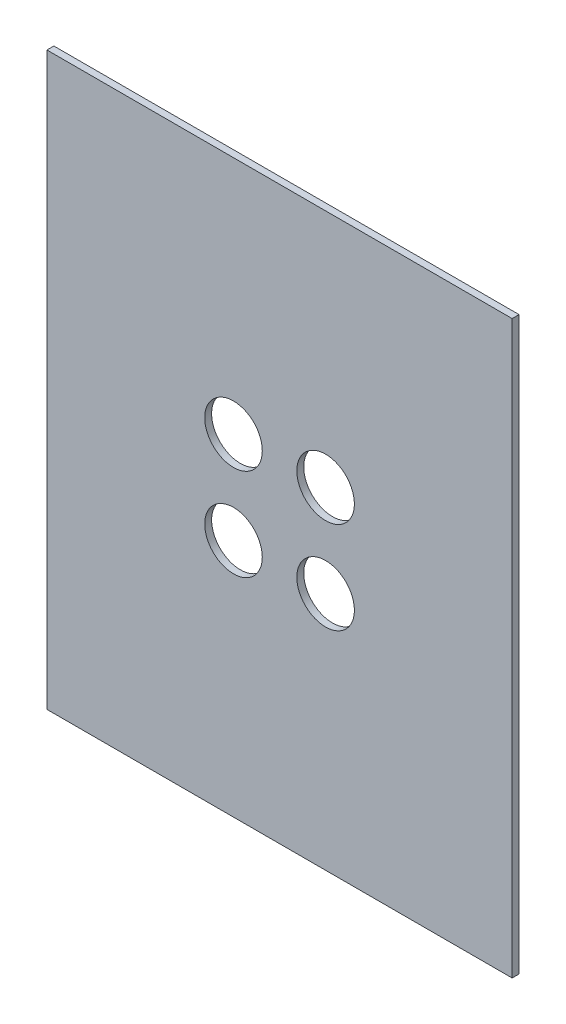
ISO-10303-21;
HEADER;
FILE_DESCRIPTION(('STEP AP214'),'2;1');
FILE_NAME('part.step','',(''),(''),'','','');
FILE_SCHEMA(('AUTOMOTIVE_DESIGN { 1 0 10303 214 1 1 1 1 }'));
ENDSEC;
DATA;
#1=APPLICATION_CONTEXT('core data for automotive mechanical design processes');
#2=APPLICATION_PROTOCOL_DEFINITION('international standard','automotive_design',2000,#1);
#3=PRODUCT_CONTEXT('',#1,'mechanical');
#4=PRODUCT('Part','Part','',(#3));
#5=PRODUCT_RELATED_PRODUCT_CATEGORY('part','',(#4));
#6=PRODUCT_DEFINITION_FORMATION('','',#4);
#7=PRODUCT_DEFINITION_CONTEXT('part definition',#1,'design');
#8=PRODUCT_DEFINITION('design','',#6,#7);
#9=PRODUCT_DEFINITION_SHAPE('','',#8);
#10=(LENGTH_UNIT() NAMED_UNIT(*) SI_UNIT(.MILLI.,.METRE.));
#11=(NAMED_UNIT(*) PLANE_ANGLE_UNIT() SI_UNIT($,.RADIAN.));
#12=(NAMED_UNIT(*) SI_UNIT($,.STERADIAN.) SOLID_ANGLE_UNIT());
#13=UNCERTAINTY_MEASURE_WITH_UNIT(LENGTH_MEASURE(1.E-05),#10,'distance_accuracy_value','');
#14=(GEOMETRIC_REPRESENTATION_CONTEXT(3) GLOBAL_UNCERTAINTY_ASSIGNED_CONTEXT((#13)) GLOBAL_UNIT_ASSIGNED_CONTEXT((#10,
#11,#12)) REPRESENTATION_CONTEXT('',''));
#15=CARTESIAN_POINT('',(0.,0.,0.));
#16=DIRECTION('',(0.,0.,1.));
#17=DIRECTION('',(1.,0.,0.));
#18=AXIS2_PLACEMENT_3D('',#15,#16,#17);
#19=CARTESIAN_POINT('',(-63.562559803188,77.1924619640387,3.));
#20=DIRECTION('',(1.,0.,0.));
#21=DIRECTION('',(0.,1.,0.));
#22=AXIS2_PLACEMENT_3D('',#19,#20,#21);
#23=PLANE('',#22);
#24=DIRECTION('',(0.,-1.,0.));
#25=VECTOR('',#24,1.);
#26=CARTESIAN_POINT('',(-63.562559803188,77.1924619640387,0.));
#27=LINE('',#26,#25);
#28=CARTESIAN_POINT('',(-63.562559803188,77.1924619640387,0.));
#29=VERTEX_POINT('',#28);
#30=CARTESIAN_POINT('',(-63.562559803188,-170.807538035961,0.));
#31=VERTEX_POINT('',#30);
#32=EDGE_CURVE('E96',#29,#31,#27,.T.);
#33=ORIENTED_EDGE('',*,*,#32,.T.);
#34=DIRECTION('',(0.,0.,-1.));
#35=VECTOR('',#34,1.);
#36=CARTESIAN_POINT('',(-63.562559803188,-170.807538035961,3.));
#37=LINE('',#36,#35);
#38=CARTESIAN_POINT('',(-63.562559803188,-170.807538035961,3.));
#39=VERTEX_POINT('',#38);
#40=EDGE_CURVE('E11',#39,#31,#37,.T.);
#41=ORIENTED_EDGE('',*,*,#40,.F.);
#42=DIRECTION('',(0.,-1.,0.));
#43=VECTOR('',#42,1.);
#44=CARTESIAN_POINT('',(-63.562559803188,77.1924619640387,3.));
#45=LINE('',#44,#43);
#46=CARTESIAN_POINT('',(-63.562559803188,77.1924619640387,3.));
#47=VERTEX_POINT('',#46);
#48=EDGE_CURVE('E84',#47,#39,#45,.T.);
#49=ORIENTED_EDGE('',*,*,#48,.F.);
#50=DIRECTION('',(0.,0.,-1.));
#51=VECTOR('',#50,1.);
#52=CARTESIAN_POINT('',(-63.562559803188,77.1924619640387,3.));
#53=LINE('',#52,#51);
#54=EDGE_CURVE('E92',#47,#29,#53,.T.);
#55=ORIENTED_EDGE('',*,*,#54,.T.);
#56=EDGE_LOOP('',(#33,#41,#49,#55));
#57=FACE_BOUND('',#56,.T.);
#58=ADVANCED_FACE('F33',(#57),#23,.F.);
#59=CARTESIAN_POINT('',(-63.562559803188,-170.807538035961,3.));
#60=DIRECTION('',(0.,1.,0.));
#61=DIRECTION('',(0.,0.,1.));
#62=AXIS2_PLACEMENT_3D('',#59,#60,#61);
#63=PLANE('',#62);
#64=DIRECTION('',(1.,0.,0.));
#65=VECTOR('',#64,1.);
#66=CARTESIAN_POINT('',(-63.562559803188,-170.807538035961,0.));
#67=LINE('',#66,#65);
#68=CARTESIAN_POINT('',(138.437440196812,-170.807538035961,0.));
#69=VERTEX_POINT('',#68);
#70=EDGE_CURVE('E88',#31,#69,#67,.T.);
#71=ORIENTED_EDGE('',*,*,#70,.T.);
#72=DIRECTION('',(0.,0.,-1.));
#73=VECTOR('',#72,1.);
#74=CARTESIAN_POINT('',(138.437440196812,-170.807538035961,3.));
#75=LINE('',#74,#73);
#76=CARTESIAN_POINT('',(138.437440196812,-170.807538035961,3.));
#77=VERTEX_POINT('',#76);
#78=EDGE_CURVE('E41',#77,#69,#75,.T.);
#79=ORIENTED_EDGE('',*,*,#78,.F.);
#80=DIRECTION('',(1.,0.,0.));
#81=VECTOR('',#80,1.);
#82=CARTESIAN_POINT('',(-63.562559803188,-170.807538035961,3.));
#83=LINE('',#82,#81);
#84=EDGE_CURVE('E79',#39,#77,#83,.T.);
#85=ORIENTED_EDGE('',*,*,#84,.F.);
#86=ORIENTED_EDGE('',*,*,#40,.T.);
#87=EDGE_LOOP('',(#71,#79,#85,#86));
#88=FACE_BOUND('',#87,.T.);
#89=ADVANCED_FACE('F87',(#88),#63,.F.);
#90=CARTESIAN_POINT('',(138.437440196812,77.1924619640387,3.));
#91=DIRECTION('',(-1.,0.,0.));
#92=DIRECTION('',(0.,-1.,0.));
#93=AXIS2_PLACEMENT_3D('',#90,#91,#92);
#94=PLANE('',#93);
#95=DIRECTION('',(0.,1.,0.));
#96=VECTOR('',#95,1.);
#97=CARTESIAN_POINT('',(138.437440196812,77.1924619640387,0.));
#98=LINE('',#97,#96);
#99=CARTESIAN_POINT('',(138.437440196812,77.1924619640387,0.));
#100=VERTEX_POINT('',#99);
#101=EDGE_CURVE('E66',#69,#100,#98,.T.);
#102=ORIENTED_EDGE('',*,*,#101,.T.);
#103=DIRECTION('',(0.,0.,-1.));
#104=VECTOR('',#103,1.);
#105=CARTESIAN_POINT('',(138.437440196812,77.1924619640387,3.));
#106=LINE('',#105,#104);
#107=CARTESIAN_POINT('',(138.437440196812,77.1924619640387,3.));
#108=VERTEX_POINT('',#107);
#109=EDGE_CURVE('E89',#108,#100,#106,.T.);
#110=ORIENTED_EDGE('',*,*,#109,.F.);
#111=DIRECTION('',(0.,1.,0.));
#112=VECTOR('',#111,1.);
#113=CARTESIAN_POINT('',(138.437440196812,77.1924619640387,3.));
#114=LINE('',#113,#112);
#115=EDGE_CURVE('E82',#77,#108,#114,.T.);
#116=ORIENTED_EDGE('',*,*,#115,.F.);
#117=ORIENTED_EDGE('',*,*,#78,.T.);
#118=EDGE_LOOP('',(#102,#110,#116,#117));
#119=FACE_BOUND('',#118,.T.);
#120=ADVANCED_FACE('F90',(#119),#94,.F.);
#121=CARTESIAN_POINT('',(-63.562559803188,77.1924619640387,3.));
#122=DIRECTION('',(0.,-1.,0.));
#123=DIRECTION('',(0.,0.,-1.));
#124=AXIS2_PLACEMENT_3D('',#121,#122,#123);
#125=PLANE('',#124);
#126=DIRECTION('',(-1.,0.,0.));
#127=VECTOR('',#126,1.);
#128=CARTESIAN_POINT('',(-63.562559803188,77.1924619640387,0.));
#129=LINE('',#128,#127);
#130=EDGE_CURVE('E72',#100,#29,#129,.T.);
#131=ORIENTED_EDGE('',*,*,#130,.T.);
#132=ORIENTED_EDGE('',*,*,#54,.F.);
#133=DIRECTION('',(-1.,0.,0.));
#134=VECTOR('',#133,1.);
#135=CARTESIAN_POINT('',(-63.562559803188,77.1924619640387,3.));
#136=LINE('',#135,#134);
#137=EDGE_CURVE('E49',#108,#47,#136,.T.);
#138=ORIENTED_EDGE('',*,*,#137,.F.);
#139=ORIENTED_EDGE('',*,*,#109,.T.);
#140=EDGE_LOOP('',(#131,#132,#138,#139));
#141=FACE_BOUND('',#140,.T.);
#142=ADVANCED_FACE('F104',(#141),#125,.F.);
#143=CARTESIAN_POINT('',(0.,0.,3.));
#144=DIRECTION('',(0.,0.,1.));
#145=DIRECTION('',(1.,0.,0.));
#146=AXIS2_PLACEMENT_3D('',#143,#144,#145);
#147=PLANE('',#146);
#148=CARTESIAN_POINT('',(17.437440196812,-66.8075380359613,3.));
#149=DIRECTION('',(0.,0.,1.));
#150=DIRECTION('',(1.,0.,0.));
#151=AXIS2_PLACEMENT_3D('',#148,#149,#150);
#152=CIRCLE('',#151,12.5);
#153=CARTESIAN_POINT('',(29.937440196812,-66.8075380359613,3.));
#154=VERTEX_POINT('',#153);
#155=EDGE_CURVE('E128',#154,#154,#152,.T.);
#156=ORIENTED_EDGE('',*,*,#155,.F.);
#157=EDGE_LOOP('',(#156));
#158=FACE_BOUND('',#157,.T.);
#159=CARTESIAN_POINT('',(57.437440196812,-66.8075380359613,3.));
#160=DIRECTION('',(0.,0.,1.));
#161=DIRECTION('',(1.,0.,0.));
#162=AXIS2_PLACEMENT_3D('',#159,#160,#161);
#163=CIRCLE('',#162,12.5);
#164=CARTESIAN_POINT('',(69.937440196812,-66.8075380359613,3.));
#165=VERTEX_POINT('',#164);
#166=EDGE_CURVE('E122',#165,#165,#163,.T.);
#167=ORIENTED_EDGE('',*,*,#166,.F.);
#168=EDGE_LOOP('',(#167));
#169=FACE_BOUND('',#168,.T.);
#170=CARTESIAN_POINT('',(57.437440196812,-26.8075380359613,3.));
#171=DIRECTION('',(0.,0.,1.));
#172=DIRECTION('',(1.,0.,0.));
#173=AXIS2_PLACEMENT_3D('',#170,#171,#172);
#174=CIRCLE('',#173,12.5);
#175=CARTESIAN_POINT('',(69.937440196812,-26.8075380359613,3.));
#176=VERTEX_POINT('',#175);
#177=EDGE_CURVE('E116',#176,#176,#174,.T.);
#178=ORIENTED_EDGE('',*,*,#177,.F.);
#179=EDGE_LOOP('',(#178));
#180=FACE_BOUND('',#179,.T.);
#181=CARTESIAN_POINT('',(17.437440196812,-26.8075380359613,3.));
#182=DIRECTION('',(0.,0.,1.));
#183=DIRECTION('',(1.,0.,0.));
#184=AXIS2_PLACEMENT_3D('',#181,#182,#183);
#185=CIRCLE('',#184,12.5);
#186=CARTESIAN_POINT('',(29.937440196812,-26.8075380359613,3.));
#187=VERTEX_POINT('',#186);
#188=EDGE_CURVE('E110',#187,#187,#185,.T.);
#189=ORIENTED_EDGE('',*,*,#188,.F.);
#190=EDGE_LOOP('',(#189));
#191=FACE_BOUND('',#190,.T.);
#192=ORIENTED_EDGE('',*,*,#48,.T.);
#193=ORIENTED_EDGE('',*,*,#84,.T.);
#194=ORIENTED_EDGE('',*,*,#115,.T.);
#195=ORIENTED_EDGE('',*,*,#137,.T.);
#196=EDGE_LOOP('',(#192,#193,#194,#195));
#197=FACE_BOUND('',#196,.T.);
#198=ADVANCED_FACE('F80',(#158,#169,#180,#191,#197),#147,.T.);
#199=CARTESIAN_POINT('',(0.,0.,0.));
#200=DIRECTION('',(0.,0.,1.));
#201=DIRECTION('',(1.,0.,0.));
#202=AXIS2_PLACEMENT_3D('',#199,#200,#201);
#203=PLANE('',#202);
#204=CARTESIAN_POINT('',(17.437440196812,-66.8075380359613,0.));
#205=DIRECTION('',(0.,0.,1.));
#206=DIRECTION('',(1.,0.,0.));
#207=AXIS2_PLACEMENT_3D('',#204,#205,#206);
#208=CIRCLE('',#207,12.5);
#209=CARTESIAN_POINT('',(29.937440196812,-66.8075380359613,0.));
#210=VERTEX_POINT('',#209);
#211=EDGE_CURVE('E125',#210,#210,#208,.T.);
#212=ORIENTED_EDGE('',*,*,#211,.T.);
#213=EDGE_LOOP('',(#212));
#214=FACE_BOUND('',#213,.T.);
#215=CARTESIAN_POINT('',(57.437440196812,-66.8075380359613,0.));
#216=DIRECTION('',(0.,0.,1.));
#217=DIRECTION('',(1.,0.,0.));
#218=AXIS2_PLACEMENT_3D('',#215,#216,#217);
#219=CIRCLE('',#218,12.5);
#220=CARTESIAN_POINT('',(69.937440196812,-66.8075380359613,0.));
#221=VERTEX_POINT('',#220);
#222=EDGE_CURVE('E119',#221,#221,#219,.T.);
#223=ORIENTED_EDGE('',*,*,#222,.T.);
#224=EDGE_LOOP('',(#223));
#225=FACE_BOUND('',#224,.T.);
#226=CARTESIAN_POINT('',(57.437440196812,-26.8075380359613,0.));
#227=DIRECTION('',(0.,0.,1.));
#228=DIRECTION('',(1.,0.,0.));
#229=AXIS2_PLACEMENT_3D('',#226,#227,#228);
#230=CIRCLE('',#229,12.5);
#231=CARTESIAN_POINT('',(69.937440196812,-26.8075380359613,0.));
#232=VERTEX_POINT('',#231);
#233=EDGE_CURVE('E113',#232,#232,#230,.T.);
#234=ORIENTED_EDGE('',*,*,#233,.T.);
#235=EDGE_LOOP('',(#234));
#236=FACE_BOUND('',#235,.T.);
#237=CARTESIAN_POINT('',(17.437440196812,-26.8075380359613,0.));
#238=DIRECTION('',(0.,0.,1.));
#239=DIRECTION('',(1.,0.,0.));
#240=AXIS2_PLACEMENT_3D('',#237,#238,#239);
#241=CIRCLE('',#240,12.5);
#242=CARTESIAN_POINT('',(29.937440196812,-26.8075380359613,0.));
#243=VERTEX_POINT('',#242);
#244=EDGE_CURVE('E99',#243,#243,#241,.T.);
#245=ORIENTED_EDGE('',*,*,#244,.T.);
#246=EDGE_LOOP('',(#245));
#247=FACE_BOUND('',#246,.T.);
#248=ORIENTED_EDGE('',*,*,#32,.F.);
#249=ORIENTED_EDGE('',*,*,#130,.F.);
#250=ORIENTED_EDGE('',*,*,#101,.F.);
#251=ORIENTED_EDGE('',*,*,#70,.F.);
#252=EDGE_LOOP('',(#248,#249,#250,#251));
#253=FACE_BOUND('',#252,.T.);
#254=ADVANCED_FACE('F107',(#214,#225,#236,#247,#253),#203,.F.);
#255=CARTESIAN_POINT('',(17.437440196812,-26.8075380359613,0.));
#256=DIRECTION('',(0.,0.,1.));
#257=DIRECTION('',(1.,0.,0.));
#258=AXIS2_PLACEMENT_3D('',#255,#256,#257);
#259=CYLINDRICAL_SURFACE('',#258,12.5);
#260=ORIENTED_EDGE('',*,*,#244,.F.);
#261=EDGE_LOOP('',(#260));
#262=FACE_BOUND('',#261,.T.);
#263=ORIENTED_EDGE('',*,*,#188,.T.);
#264=EDGE_LOOP('',(#263));
#265=FACE_BOUND('',#264,.T.);
#266=ADVANCED_FACE('F152',(#262,#265),#259,.F.);
#267=CARTESIAN_POINT('',(57.437440196812,-26.8075380359613,0.));
#268=DIRECTION('',(0.,0.,1.));
#269=DIRECTION('',(1.,0.,0.));
#270=AXIS2_PLACEMENT_3D('',#267,#268,#269);
#271=CYLINDRICAL_SURFACE('',#270,12.5);
#272=ORIENTED_EDGE('',*,*,#233,.F.);
#273=EDGE_LOOP('',(#272));
#274=FACE_BOUND('',#273,.T.);
#275=ORIENTED_EDGE('',*,*,#177,.T.);
#276=EDGE_LOOP('',(#275));
#277=FACE_BOUND('',#276,.T.);
#278=ADVANCED_FACE('F154',(#274,#277),#271,.F.);
#279=CARTESIAN_POINT('',(57.437440196812,-66.8075380359613,0.));
#280=DIRECTION('',(0.,0.,1.));
#281=DIRECTION('',(1.,0.,0.));
#282=AXIS2_PLACEMENT_3D('',#279,#280,#281);
#283=CYLINDRICAL_SURFACE('',#282,12.5);
#284=ORIENTED_EDGE('',*,*,#222,.F.);
#285=EDGE_LOOP('',(#284));
#286=FACE_BOUND('',#285,.T.);
#287=ORIENTED_EDGE('',*,*,#166,.T.);
#288=EDGE_LOOP('',(#287));
#289=FACE_BOUND('',#288,.T.);
#290=ADVANCED_FACE('F139',(#286,#289),#283,.F.);
#291=CARTESIAN_POINT('',(17.437440196812,-66.8075380359613,0.));
#292=DIRECTION('',(0.,0.,1.));
#293=DIRECTION('',(1.,0.,0.));
#294=AXIS2_PLACEMENT_3D('',#291,#292,#293);
#295=CYLINDRICAL_SURFACE('',#294,12.5);
#296=ORIENTED_EDGE('',*,*,#211,.F.);
#297=EDGE_LOOP('',(#296));
#298=FACE_BOUND('',#297,.T.);
#299=ORIENTED_EDGE('',*,*,#155,.T.);
#300=EDGE_LOOP('',(#299));
#301=FACE_BOUND('',#300,.T.);
#302=ADVANCED_FACE('F136',(#298,#301),#295,.F.);
#303=CLOSED_SHELL('',(#58,#89,#120,#142,#198,#254,#266,#278,#290,#302));
#304=MANIFOLD_SOLID_BREP('B2',#303);
#305=ADVANCED_BREP_SHAPE_REPRESENTATION('',(#18,#304),#14);
#306=SHAPE_DEFINITION_REPRESENTATION(#9,#305);
ENDSEC;
END-ISO-10303-21;
